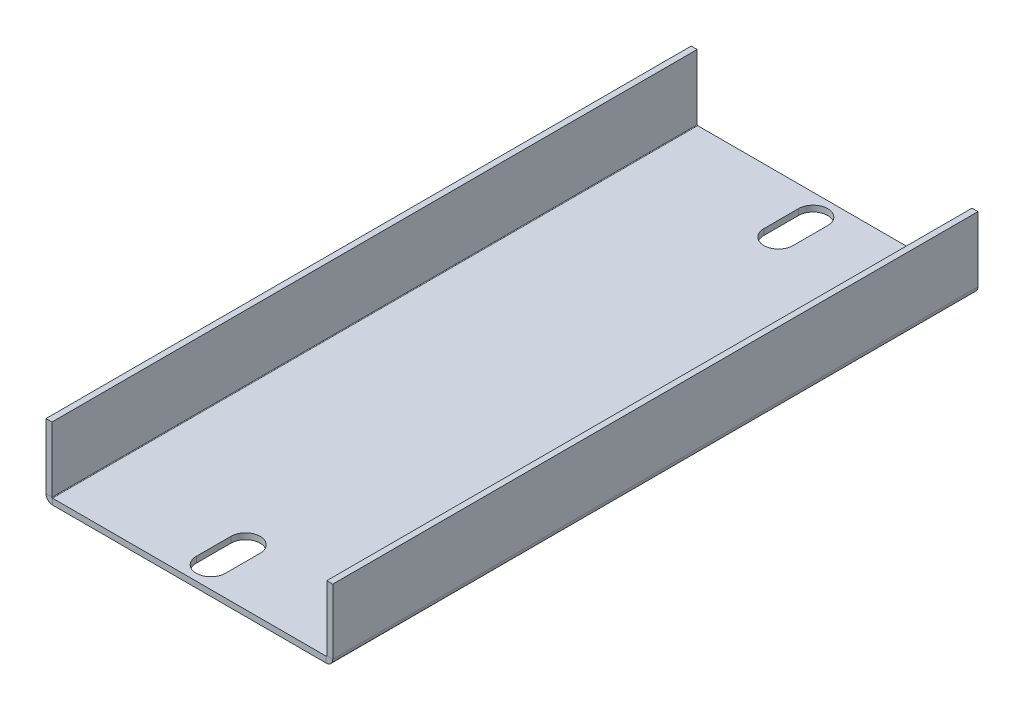
ISO-10303-21;
HEADER;
FILE_DESCRIPTION(('STEP AP214'),'2;1');
FILE_NAME('part.step','',(''),(''),'','','');
FILE_SCHEMA(('AUTOMOTIVE_DESIGN { 1 0 10303 214 1 1 1 1 }'));
ENDSEC;
DATA;
#1=APPLICATION_CONTEXT('core data for automotive mechanical design processes');
#2=APPLICATION_PROTOCOL_DEFINITION('international standard','automotive_design',2000,#1);
#3=PRODUCT_CONTEXT('',#1,'mechanical');
#4=PRODUCT('Part','Part','',(#3));
#5=PRODUCT_RELATED_PRODUCT_CATEGORY('part','',(#4));
#6=PRODUCT_DEFINITION_FORMATION('','',#4);
#7=PRODUCT_DEFINITION_CONTEXT('part definition',#1,'design');
#8=PRODUCT_DEFINITION('design','',#6,#7);
#9=PRODUCT_DEFINITION_SHAPE('','',#8);
#10=(LENGTH_UNIT() NAMED_UNIT(*) SI_UNIT(.MILLI.,.METRE.));
#11=(NAMED_UNIT(*) PLANE_ANGLE_UNIT() SI_UNIT($,.RADIAN.));
#12=(NAMED_UNIT(*) SI_UNIT($,.STERADIAN.) SOLID_ANGLE_UNIT());
#13=UNCERTAINTY_MEASURE_WITH_UNIT(LENGTH_MEASURE(1.E-05),#10,'distance_accuracy_value','');
#14=(GEOMETRIC_REPRESENTATION_CONTEXT(3) GLOBAL_UNCERTAINTY_ASSIGNED_CONTEXT((#13)) GLOBAL_UNIT_ASSIGNED_CONTEXT((#10,
#11,#12)) REPRESENTATION_CONTEXT('',''));
#15=CARTESIAN_POINT('',(0.,0.,0.));
#16=DIRECTION('',(0.,0.,1.));
#17=DIRECTION('',(1.,0.,0.));
#18=AXIS2_PLACEMENT_3D('',#15,#16,#17);
#19=CARTESIAN_POINT('',(-170.597305372499,-0.999999999999994,-11.0415945787923));
#20=DIRECTION('',(0.,1.,0.));
#21=DIRECTION('',(-1.,0.,0.));
#22=AXIS2_PLACEMENT_3D('',#19,#20,#21);
#23=PLANE('',#22);
#24=DIRECTION('',(0.,0.,1.));
#25=VECTOR('',#24,1.);
#26=CARTESIAN_POINT('',(46.5,-0.999999999999994,-11.0415945787923));
#27=LINE('',#26,#25);
#28=CARTESIAN_POINT('',(46.5,-0.999999999999994,1.00000000000001));
#29=VERTEX_POINT('',#28);
#30=CARTESIAN_POINT('',(46.5,-0.999999999999994,109.));
#31=VERTEX_POINT('',#30);
#32=EDGE_CURVE('E296',#29,#31,#27,.T.);
#33=ORIENTED_EDGE('',*,*,#32,.F.);
#34=DIRECTION('',(1.,0.,0.));
#35=VECTOR('',#34,1.);
#36=CARTESIAN_POINT('',(-170.597305372499,-0.999999999999994,1.00000000000001));
#37=LINE('',#36,#35);
#38=CARTESIAN_POINT('',(45.5,-0.999999999999994,1.00000000000001));
#39=VERTEX_POINT('',#38);
#40=EDGE_CURVE('E12',#39,#29,#37,.T.);
#41=ORIENTED_EDGE('',*,*,#40,.F.);
#42=DIRECTION('',(0.,0.,1.));
#43=VECTOR('',#42,1.);
#44=CARTESIAN_POINT('',(45.5,-0.999999999999994,-11.0415945787923));
#45=LINE('',#44,#43);
#46=CARTESIAN_POINT('',(45.5,-0.999999999999994,109.));
#47=VERTEX_POINT('',#46);
#48=EDGE_CURVE('E79',#39,#47,#45,.T.);
#49=ORIENTED_EDGE('',*,*,#48,.T.);
#50=DIRECTION('',(1.,0.,0.));
#51=VECTOR('',#50,1.);
#52=CARTESIAN_POINT('',(-170.597305372499,-0.999999999999994,109.));
#53=LINE('',#52,#51);
#54=EDGE_CURVE('E298',#47,#31,#53,.T.);
#55=ORIENTED_EDGE('',*,*,#54,.T.);
#56=EDGE_LOOP('',(#33,#41,#49,#55));
#57=FACE_BOUND('',#56,.T.);
#58=ADVANCED_FACE('F53',(#57),#23,.T.);
#59=CARTESIAN_POINT('',(-170.597305372499,-13.,109.));
#60=DIRECTION('',(0.,0.,1.));
#61=DIRECTION('',(0.,1.,0.));
#62=AXIS2_PLACEMENT_3D('',#59,#60,#61);
#63=PLANE('',#62);
#64=DIRECTION('',(0.,1.,0.));
#65=VECTOR('',#64,1.);
#66=CARTESIAN_POINT('',(46.5,-13.,109.));
#67=LINE('',#66,#65);
#68=CARTESIAN_POINT('',(46.5,-11.9,109.));
#69=VERTEX_POINT('',#68);
#70=EDGE_CURVE('E107',#69,#31,#67,.T.);
#71=ORIENTED_EDGE('',*,*,#70,.T.);
#72=ORIENTED_EDGE('',*,*,#54,.F.);
#73=DIRECTION('',(0.,-1.,0.));
#74=VECTOR('',#73,1.);
#75=CARTESIAN_POINT('',(45.5,-13.,109.));
#76=LINE('',#75,#74);
#77=CARTESIAN_POINT('',(45.5,-11.9,109.));
#78=VERTEX_POINT('',#77);
#79=EDGE_CURVE('E289',#47,#78,#76,.T.);
#80=ORIENTED_EDGE('',*,*,#79,.T.);
#81=DIRECTION('',(1.,0.,0.));
#82=VECTOR('',#81,1.);
#83=CARTESIAN_POINT('',(-170.597305372499,-11.9,109.));
#84=LINE('',#83,#82);
#85=EDGE_CURVE('E278',#78,#69,#84,.T.);
#86=ORIENTED_EDGE('',*,*,#85,.T.);
#87=EDGE_LOOP('',(#71,#72,#80,#86));
#88=FACE_BOUND('',#87,.T.);
#89=ADVANCED_FACE('F288',(#88),#63,.T.);
#90=CARTESIAN_POINT('',(46.5,-13.,109.));
#91=DIRECTION('',(-1.,0.,0.));
#92=DIRECTION('',(0.,0.,1.));
#93=AXIS2_PLACEMENT_3D('',#90,#91,#92);
#94=PLANE('',#93);
#95=ORIENTED_EDGE('',*,*,#70,.F.);
#96=DIRECTION('',(0.,0.,-1.));
#97=VECTOR('',#96,1.);
#98=CARTESIAN_POINT('',(46.5,-11.9,109.));
#99=LINE('',#98,#97);
#100=CARTESIAN_POINT('',(46.5,-11.9,1.00000000000001));
#101=VERTEX_POINT('',#100);
#102=EDGE_CURVE('E268',#69,#101,#99,.T.);
#103=ORIENTED_EDGE('',*,*,#102,.T.);
#104=DIRECTION('',(0.,1.,0.));
#105=VECTOR('',#104,1.);
#106=CARTESIAN_POINT('',(46.5,-13.,1.00000000000001));
#107=LINE('',#106,#105);
#108=EDGE_CURVE('E277',#101,#29,#107,.T.);
#109=ORIENTED_EDGE('',*,*,#108,.T.);
#110=ORIENTED_EDGE('',*,*,#32,.T.);
#111=EDGE_LOOP('',(#95,#103,#109,#110));
#112=FACE_BOUND('',#111,.T.);
#113=ADVANCED_FACE('F294',(#112),#94,.F.);
#114=CARTESIAN_POINT('',(-170.597305372499,-13.,1.00000000000001));
#115=DIRECTION('',(0.,0.,-1.));
#116=DIRECTION('',(0.,-1.,0.));
#117=AXIS2_PLACEMENT_3D('',#114,#115,#116);
#118=PLANE('',#117);
#119=ORIENTED_EDGE('',*,*,#108,.F.);
#120=DIRECTION('',(1.,0.,0.));
#121=VECTOR('',#120,1.);
#122=CARTESIAN_POINT('',(-170.597305372499,-11.9,1.00000000000001));
#123=LINE('',#122,#121);
#124=CARTESIAN_POINT('',(45.5,-11.9,1.));
#125=VERTEX_POINT('',#124);
#126=EDGE_CURVE('E407',#125,#101,#123,.T.);
#127=ORIENTED_EDGE('',*,*,#126,.F.);
#128=DIRECTION('',(0.,1.,0.));
#129=VECTOR('',#128,1.);
#130=CARTESIAN_POINT('',(45.5,-13.,1.00000000000001));
#131=LINE('',#130,#129);
#132=EDGE_CURVE('E66',#125,#39,#131,.T.);
#133=ORIENTED_EDGE('',*,*,#132,.T.);
#134=ORIENTED_EDGE('',*,*,#40,.T.);
#135=EDGE_LOOP('',(#119,#127,#133,#134));
#136=FACE_BOUND('',#135,.T.);
#137=ADVANCED_FACE('F414',(#136),#118,.T.);
#138=CARTESIAN_POINT('',(45.5,-13.,-11.0415945787923));
#139=DIRECTION('',(-1.,0.,0.));
#140=DIRECTION('',(0.,0.,1.));
#141=AXIS2_PLACEMENT_3D('',#138,#139,#140);
#142=PLANE('',#141);
#143=DIRECTION('',(0.,0.,-1.));
#144=VECTOR('',#143,1.);
#145=CARTESIAN_POINT('',(45.5,-11.9,109.));
#146=LINE('',#145,#144);
#147=EDGE_CURVE('E58',#78,#125,#146,.T.);
#148=ORIENTED_EDGE('',*,*,#147,.F.);
#149=ORIENTED_EDGE('',*,*,#79,.F.);
#150=ORIENTED_EDGE('',*,*,#48,.F.);
#151=ORIENTED_EDGE('',*,*,#132,.F.);
#152=EDGE_LOOP('',(#148,#149,#150,#151));
#153=FACE_BOUND('',#152,.T.);
#154=ADVANCED_FACE('F56',(#153),#142,.T.);
#155=CARTESIAN_POINT('',(215.597305372499,-1.,-11.0415945787923));
#156=DIRECTION('',(0.,-1.,0.));
#157=DIRECTION('',(1.,0.,0.));
#158=AXIS2_PLACEMENT_3D('',#155,#156,#157);
#159=PLANE('',#158);
#160=DIRECTION('',(-1.,0.,0.));
#161=VECTOR('',#160,1.);
#162=CARTESIAN_POINT('',(215.597305372499,-1.,1.00000000000002));
#163=LINE('',#162,#161);
#164=CARTESIAN_POINT('',(-0.500000000000014,-1.,1.00000000000001));
#165=VERTEX_POINT('',#164);
#166=CARTESIAN_POINT('',(-1.50000000000003,-0.999999999999999,1.00000000000001));
#167=VERTEX_POINT('',#166);
#168=EDGE_CURVE('E623',#165,#167,#163,.T.);
#169=ORIENTED_EDGE('',*,*,#168,.T.);
#170=DIRECTION('',(0.,0.,1.));
#171=VECTOR('',#170,1.);
#172=CARTESIAN_POINT('',(-1.50000000000001,-1.,-11.0415945787923));
#173=LINE('',#172,#171);
#174=CARTESIAN_POINT('',(-1.50000000000001,-1.,109.));
#175=VERTEX_POINT('',#174);
#176=EDGE_CURVE('E379',#167,#175,#173,.T.);
#177=ORIENTED_EDGE('',*,*,#176,.T.);
#178=DIRECTION('',(-1.,0.,0.));
#179=VECTOR('',#178,1.);
#180=CARTESIAN_POINT('',(215.597305372499,-1.,109.));
#181=LINE('',#180,#179);
#182=CARTESIAN_POINT('',(-0.500000000000025,-0.999999999999999,109.));
#183=VERTEX_POINT('',#182);
#184=EDGE_CURVE('E420',#183,#175,#181,.T.);
#185=ORIENTED_EDGE('',*,*,#184,.F.);
#186=DIRECTION('',(0.,0.,1.));
#187=VECTOR('',#186,1.);
#188=CARTESIAN_POINT('',(-0.500000000000014,-1.,-11.0415945787923));
#189=LINE('',#188,#187);
#190=EDGE_CURVE('E120',#165,#183,#189,.T.);
#191=ORIENTED_EDGE('',*,*,#190,.F.);
#192=EDGE_LOOP('',(#169,#177,#185,#191));
#193=FACE_BOUND('',#192,.T.);
#194=ADVANCED_FACE('F663',(#193),#159,.F.);
#195=CARTESIAN_POINT('',(215.597305372499,-13.,1.00000000000002));
#196=DIRECTION('',(0.,0.,-1.));
#197=DIRECTION('',(0.,1.,0.));
#198=AXIS2_PLACEMENT_3D('',#195,#196,#197);
#199=PLANE('',#198);
#200=DIRECTION('',(0.,1.,0.));
#201=VECTOR('',#200,1.);
#202=CARTESIAN_POINT('',(-1.50000000000002,-13.,1.00000000000001));
#203=LINE('',#202,#201);
#204=CARTESIAN_POINT('',(-1.50000000000001,-11.9000000000001,1.));
#205=VERTEX_POINT('',#204);
#206=EDGE_CURVE('E148',#205,#167,#203,.T.);
#207=ORIENTED_EDGE('',*,*,#206,.T.);
#208=ORIENTED_EDGE('',*,*,#168,.F.);
#209=DIRECTION('',(0.,-1.,0.));
#210=VECTOR('',#209,1.);
#211=CARTESIAN_POINT('',(-0.500000000000014,-13.,1.00000000000001));
#212=LINE('',#211,#210);
#213=CARTESIAN_POINT('',(-0.500000000000014,-11.9,1.));
#214=VERTEX_POINT('',#213);
#215=EDGE_CURVE('E369',#165,#214,#212,.T.);
#216=ORIENTED_EDGE('',*,*,#215,.T.);
#217=DIRECTION('',(-1.,0.,0.));
#218=VECTOR('',#217,1.);
#219=CARTESIAN_POINT('',(215.597305372499,-11.9,1.00000000000002));
#220=LINE('',#219,#218);
#221=EDGE_CURVE('E375',#214,#205,#220,.T.);
#222=ORIENTED_EDGE('',*,*,#221,.T.);
#223=EDGE_LOOP('',(#207,#208,#216,#222));
#224=FACE_BOUND('',#223,.T.);
#225=ADVANCED_FACE('F655',(#224),#199,.T.);
#226=CARTESIAN_POINT('',(-1.50000000000002,-13.,109.));
#227=DIRECTION('',(1.,0.,0.));
#228=DIRECTION('',(0.,0.,-1.));
#229=AXIS2_PLACEMENT_3D('',#226,#227,#228);
#230=PLANE('',#229);
#231=ORIENTED_EDGE('',*,*,#206,.F.);
#232=DIRECTION('',(0.,0.,1.));
#233=VECTOR('',#232,1.);
#234=CARTESIAN_POINT('',(-1.50000000000003,-11.9,1.00000000000001));
#235=LINE('',#234,#233);
#236=CARTESIAN_POINT('',(-1.50000000000002,-11.9,109.));
#237=VERTEX_POINT('',#236);
#238=EDGE_CURVE('E390',#205,#237,#235,.T.);
#239=ORIENTED_EDGE('',*,*,#238,.T.);
#240=DIRECTION('',(0.,1.,0.));
#241=VECTOR('',#240,1.);
#242=CARTESIAN_POINT('',(-1.50000000000003,-13.,109.));
#243=LINE('',#242,#241);
#244=EDGE_CURVE('E384',#237,#175,#243,.T.);
#245=ORIENTED_EDGE('',*,*,#244,.T.);
#246=ORIENTED_EDGE('',*,*,#176,.F.);
#247=EDGE_LOOP('',(#231,#239,#245,#246));
#248=FACE_BOUND('',#247,.T.);
#249=ADVANCED_FACE('F659',(#248),#230,.F.);
#250=CARTESIAN_POINT('',(215.597305372499,-13.,109.));
#251=DIRECTION('',(0.,0.,1.));
#252=DIRECTION('',(0.,-1.,0.));
#253=AXIS2_PLACEMENT_3D('',#250,#251,#252);
#254=PLANE('',#253);
#255=ORIENTED_EDGE('',*,*,#244,.F.);
#256=DIRECTION('',(-1.,0.,0.));
#257=VECTOR('',#256,1.);
#258=CARTESIAN_POINT('',(215.597305372499,-11.9,109.));
#259=LINE('',#258,#257);
#260=CARTESIAN_POINT('',(-0.500000000000015,-11.9,109.));
#261=VERTEX_POINT('',#260);
#262=EDGE_CURVE('E356',#261,#237,#259,.T.);
#263=ORIENTED_EDGE('',*,*,#262,.F.);
#264=DIRECTION('',(0.,1.,0.));
#265=VECTOR('',#264,1.);
#266=CARTESIAN_POINT('',(-0.500000000000025,-13.,109.));
#267=LINE('',#266,#265);
#268=EDGE_CURVE('E389',#261,#183,#267,.T.);
#269=ORIENTED_EDGE('',*,*,#268,.T.);
#270=ORIENTED_EDGE('',*,*,#184,.T.);
#271=EDGE_LOOP('',(#255,#263,#269,#270));
#272=FACE_BOUND('',#271,.T.);
#273=ADVANCED_FACE('F665',(#272),#254,.T.);
#274=CARTESIAN_POINT('',(-0.500000000000014,-13.,-11.0415945787923));
#275=DIRECTION('',(1.,0.,0.));
#276=DIRECTION('',(0.,0.,-1.));
#277=AXIS2_PLACEMENT_3D('',#274,#275,#276);
#278=PLANE('',#277);
#279=DIRECTION('',(0.,0.,1.));
#280=VECTOR('',#279,1.);
#281=CARTESIAN_POINT('',(-0.500000000000025,-11.9,1.00000000000001));
#282=LINE('',#281,#280);
#283=EDGE_CURVE('E352',#214,#261,#282,.T.);
#284=ORIENTED_EDGE('',*,*,#283,.F.);
#285=ORIENTED_EDGE('',*,*,#215,.F.);
#286=ORIENTED_EDGE('',*,*,#190,.T.);
#287=ORIENTED_EDGE('',*,*,#268,.F.);
#288=EDGE_LOOP('',(#284,#285,#286,#287));
#289=FACE_BOUND('',#288,.T.);
#290=ADVANCED_FACE('F667',(#289),#278,.T.);
#291=CARTESIAN_POINT('',(0.,-13.,0.));
#292=DIRECTION('',(0.,1.,0.));
#293=DIRECTION('',(0.,0.,1.));
#294=AXIS2_PLACEMENT_3D('',#291,#292,#293);
#295=PLANE('',#294);
#296=CARTESIAN_POINT('',(22.5,-13.,4.6));
#297=DIRECTION('',(0.,-1.,0.));
#298=DIRECTION('',(0.,0.,-1.));
#299=AXIS2_PLACEMENT_3D('',#296,#297,#298);
#300=CIRCLE('',#299,2.45);
#301=CARTESIAN_POINT('',(20.05,-13.,4.6));
#302=VERTEX_POINT('',#301);
#303=CARTESIAN_POINT('',(24.95,-13.,4.60000000000001));
#304=VERTEX_POINT('',#303);
#305=EDGE_CURVE('E505',#302,#304,#300,.T.);
#306=ORIENTED_EDGE('',*,*,#305,.F.);
#307=DIRECTION('',(0.,0.,-1.));
#308=VECTOR('',#307,1.);
#309=CARTESIAN_POINT('',(20.05,-13.,4.6));
#310=LINE('',#309,#308);
#311=CARTESIAN_POINT('',(20.05,-13.,10.4));
#312=VERTEX_POINT('',#311);
#313=EDGE_CURVE('E512',#312,#302,#310,.T.);
#314=ORIENTED_EDGE('',*,*,#313,.F.);
#315=CARTESIAN_POINT('',(22.5,-13.,10.4));
#316=DIRECTION('',(0.,-1.,0.));
#317=DIRECTION('',(0.,0.,-1.));
#318=AXIS2_PLACEMENT_3D('',#315,#316,#317);
#319=CIRCLE('',#318,2.45);
#320=CARTESIAN_POINT('',(24.95,-13.,10.4));
#321=VERTEX_POINT('',#320);
#322=EDGE_CURVE('E526',#321,#312,#319,.T.);
#323=ORIENTED_EDGE('',*,*,#322,.F.);
#324=DIRECTION('',(0.,0.,1.));
#325=VECTOR('',#324,1.);
#326=CARTESIAN_POINT('',(24.95,-13.,4.60000000000001));
#327=LINE('',#326,#325);
#328=EDGE_CURVE('E500',#304,#321,#327,.T.);
#329=ORIENTED_EDGE('',*,*,#328,.F.);
#330=EDGE_LOOP('',(#306,#314,#323,#329));
#331=FACE_BOUND('',#330,.T.);
#332=CARTESIAN_POINT('',(22.5,-13.,105.4));
#333=DIRECTION('',(0.,-1.,0.));
#334=DIRECTION('',(0.,0.,1.));
#335=AXIS2_PLACEMENT_3D('',#332,#333,#334);
#336=CIRCLE('',#335,2.45);
#337=CARTESIAN_POINT('',(24.95,-13.,105.4));
#338=VERTEX_POINT('',#337);
#339=CARTESIAN_POINT('',(20.05,-13.,105.4));
#340=VERTEX_POINT('',#339);
#341=EDGE_CURVE('E486',#338,#340,#336,.T.);
#342=ORIENTED_EDGE('',*,*,#341,.F.);
#343=DIRECTION('',(0.,0.,1.));
#344=VECTOR('',#343,1.);
#345=CARTESIAN_POINT('',(24.95,-13.,105.4));
#346=LINE('',#345,#344);
#347=CARTESIAN_POINT('',(24.95,-13.,99.6));
#348=VERTEX_POINT('',#347);
#349=EDGE_CURVE('E492',#348,#338,#346,.T.);
#350=ORIENTED_EDGE('',*,*,#349,.F.);
#351=CARTESIAN_POINT('',(22.5,-13.,99.6));
#352=DIRECTION('',(0.,-1.,0.));
#353=DIRECTION('',(0.,0.,1.));
#354=AXIS2_PLACEMENT_3D('',#351,#352,#353);
#355=CIRCLE('',#354,2.45);
#356=CARTESIAN_POINT('',(20.05,-13.,99.6));
#357=VERTEX_POINT('',#356);
#358=EDGE_CURVE('E470',#357,#348,#355,.T.);
#359=ORIENTED_EDGE('',*,*,#358,.F.);
#360=DIRECTION('',(0.,0.,-1.));
#361=VECTOR('',#360,1.);
#362=CARTESIAN_POINT('',(20.05,-13.,105.4));
#363=LINE('',#362,#361);
#364=EDGE_CURVE('E465',#340,#357,#363,.T.);
#365=ORIENTED_EDGE('',*,*,#364,.F.);
#366=EDGE_LOOP('',(#342,#350,#359,#365));
#367=FACE_BOUND('',#366,.T.);
#368=DIRECTION('',(0.,0.,-1.));
#369=VECTOR('',#368,1.);
#370=CARTESIAN_POINT('',(45.4,-13.,109.));
#371=LINE('',#370,#369);
#372=CARTESIAN_POINT('',(45.4,-13.,109.));
#373=VERTEX_POINT('',#372);
#374=CARTESIAN_POINT('',(45.4,-13.,1.));
#375=VERTEX_POINT('',#374);
#376=EDGE_CURVE('E441',#373,#375,#371,.T.);
#377=ORIENTED_EDGE('',*,*,#376,.F.);
#378=DIRECTION('',(-1.,0.,0.));
#379=VECTOR('',#378,1.);
#380=CARTESIAN_POINT('',(46.5,-13.,109.));
#381=LINE('',#380,#379);
#382=CARTESIAN_POINT('',(-0.400000000000003,-13.,109.));
#383=VERTEX_POINT('',#382);
#384=EDGE_CURVE('E481',#373,#383,#381,.T.);
#385=ORIENTED_EDGE('',*,*,#384,.T.);
#386=DIRECTION('',(0.,0.,1.));
#387=VECTOR('',#386,1.);
#388=CARTESIAN_POINT('',(-0.400000000000014,-13.,1.00000000000001));
#389=LINE('',#388,#387);
#390=CARTESIAN_POINT('',(-0.400000000000005,-13.,1.));
#391=VERTEX_POINT('',#390);
#392=EDGE_CURVE('E357',#391,#383,#389,.T.);
#393=ORIENTED_EDGE('',*,*,#392,.F.);
#394=DIRECTION('',(1.,0.,0.));
#395=VECTOR('',#394,1.);
#396=CARTESIAN_POINT('',(46.5,-13.,1.00000000000001));
#397=LINE('',#396,#395);
#398=EDGE_CURVE('E487',#391,#375,#397,.T.);
#399=ORIENTED_EDGE('',*,*,#398,.T.);
#400=EDGE_LOOP('',(#377,#385,#393,#399));
#401=FACE_BOUND('',#400,.T.);
#402=ADVANCED_FACE('F547',(#331,#367,#401),#295,.F.);
#403=CARTESIAN_POINT('',(0.,-12.,0.));
#404=DIRECTION('',(0.,1.,0.));
#405=DIRECTION('',(0.,0.,1.));
#406=AXIS2_PLACEMENT_3D('',#403,#404,#405);
#407=PLANE('',#406);
#408=DIRECTION('',(0.,0.,-1.));
#409=VECTOR('',#408,1.);
#410=CARTESIAN_POINT('',(20.05,-12.,4.6));
#411=LINE('',#410,#409);
#412=CARTESIAN_POINT('',(20.05,-12.,10.4));
#413=VERTEX_POINT('',#412);
#414=CARTESIAN_POINT('',(20.05,-12.,4.6));
#415=VERTEX_POINT('',#414);
#416=EDGE_CURVE('E552',#413,#415,#411,.T.);
#417=ORIENTED_EDGE('',*,*,#416,.T.);
#418=CARTESIAN_POINT('',(22.5,-12.,4.6));
#419=DIRECTION('',(0.,-1.,0.));
#420=DIRECTION('',(0.,0.,-1.));
#421=AXIS2_PLACEMENT_3D('',#418,#419,#420);
#422=CIRCLE('',#421,2.45);
#423=CARTESIAN_POINT('',(24.95,-12.,4.60000000000001));
#424=VERTEX_POINT('',#423);
#425=EDGE_CURVE('E539',#415,#424,#422,.T.);
#426=ORIENTED_EDGE('',*,*,#425,.T.);
#427=DIRECTION('',(0.,0.,1.));
#428=VECTOR('',#427,1.);
#429=CARTESIAN_POINT('',(24.95,-12.,4.60000000000001));
#430=LINE('',#429,#428);
#431=CARTESIAN_POINT('',(24.95,-12.,10.4));
#432=VERTEX_POINT('',#431);
#433=EDGE_CURVE('E545',#424,#432,#430,.T.);
#434=ORIENTED_EDGE('',*,*,#433,.T.);
#435=CARTESIAN_POINT('',(22.5,-12.,10.4));
#436=DIRECTION('',(0.,-1.,0.));
#437=DIRECTION('',(0.,0.,-1.));
#438=AXIS2_PLACEMENT_3D('',#435,#436,#437);
#439=CIRCLE('',#438,2.45);
#440=EDGE_CURVE('E590',#432,#413,#439,.T.);
#441=ORIENTED_EDGE('',*,*,#440,.T.);
#442=EDGE_LOOP('',(#417,#426,#434,#441));
#443=FACE_BOUND('',#442,.T.);
#444=DIRECTION('',(0.,0.,1.));
#445=VECTOR('',#444,1.);
#446=CARTESIAN_POINT('',(24.95,-12.,105.4));
#447=LINE('',#446,#445);
#448=CARTESIAN_POINT('',(24.95,-12.,99.6));
#449=VERTEX_POINT('',#448);
#450=CARTESIAN_POINT('',(24.95,-12.,105.4));
#451=VERTEX_POINT('',#450);
#452=EDGE_CURVE('E594',#449,#451,#447,.T.);
#453=ORIENTED_EDGE('',*,*,#452,.T.);
#454=CARTESIAN_POINT('',(22.5,-12.,105.4));
#455=DIRECTION('',(0.,-1.,0.));
#456=DIRECTION('',(0.,0.,1.));
#457=AXIS2_PLACEMENT_3D('',#454,#455,#456);
#458=CIRCLE('',#457,2.45);
#459=CARTESIAN_POINT('',(20.05,-12.,105.4));
#460=VERTEX_POINT('',#459);
#461=EDGE_CURVE('E563',#451,#460,#458,.T.);
#462=ORIENTED_EDGE('',*,*,#461,.T.);
#463=DIRECTION('',(0.,0.,-1.));
#464=VECTOR('',#463,1.);
#465=CARTESIAN_POINT('',(20.05,-12.,105.4));
#466=LINE('',#465,#464);
#467=CARTESIAN_POINT('',(20.05,-12.,99.6));
#468=VERTEX_POINT('',#467);
#469=EDGE_CURVE('E559',#460,#468,#466,.T.);
#470=ORIENTED_EDGE('',*,*,#469,.T.);
#471=CARTESIAN_POINT('',(22.5,-12.,99.6));
#472=DIRECTION('',(0.,-1.,0.));
#473=DIRECTION('',(0.,0.,1.));
#474=AXIS2_PLACEMENT_3D('',#471,#472,#473);
#475=CIRCLE('',#474,2.45);
#476=EDGE_CURVE('E556',#468,#449,#475,.T.);
#477=ORIENTED_EDGE('',*,*,#476,.T.);
#478=EDGE_LOOP('',(#453,#462,#470,#477));
#479=FACE_BOUND('',#478,.T.);
#480=DIRECTION('',(-1.,0.,0.));
#481=VECTOR('',#480,1.);
#482=CARTESIAN_POINT('',(46.5,-12.,109.));
#483=LINE('',#482,#481);
#484=CARTESIAN_POINT('',(45.4,-12.,109.));
#485=VERTEX_POINT('',#484);
#486=CARTESIAN_POINT('',(-0.400000000000011,-12.,109.));
#487=VERTEX_POINT('',#486);
#488=EDGE_CURVE('E572',#485,#487,#483,.T.);
#489=ORIENTED_EDGE('',*,*,#488,.F.);
#490=DIRECTION('',(0.,0.,-1.));
#491=VECTOR('',#490,1.);
#492=CARTESIAN_POINT('',(45.4,-12.,109.));
#493=LINE('',#492,#491);
#494=CARTESIAN_POINT('',(45.4,-12.,1.00000000000001));
#495=VERTEX_POINT('',#494);
#496=EDGE_CURVE('E444',#485,#495,#493,.T.);
#497=ORIENTED_EDGE('',*,*,#496,.T.);
#498=DIRECTION('',(1.,0.,0.));
#499=VECTOR('',#498,1.);
#500=CARTESIAN_POINT('',(46.5,-12.,1.00000000000001));
#501=LINE('',#500,#499);
#502=CARTESIAN_POINT('',(-0.400000000000014,-12.,1.));
#503=VERTEX_POINT('',#502);
#504=EDGE_CURVE('E342',#503,#495,#501,.T.);
#505=ORIENTED_EDGE('',*,*,#504,.F.);
#506=DIRECTION('',(0.,0.,1.));
#507=VECTOR('',#506,1.);
#508=CARTESIAN_POINT('',(-0.400000000000014,-12.,1.00000000000001));
#509=LINE('',#508,#507);
#510=EDGE_CURVE('E426',#503,#487,#509,.T.);
#511=ORIENTED_EDGE('',*,*,#510,.T.);
#512=EDGE_LOOP('',(#489,#497,#505,#511));
#513=FACE_BOUND('',#512,.T.);
#514=ADVANCED_FACE('F601',(#443,#479,#513),#407,.T.);
#515=CARTESIAN_POINT('',(20.05,-13.,105.4));
#516=DIRECTION('',(1.,0.,0.));
#517=DIRECTION('',(0.,0.,-1.));
#518=AXIS2_PLACEMENT_3D('',#515,#516,#517);
#519=PLANE('',#518);
#520=ORIENTED_EDGE('',*,*,#469,.F.);
#521=DIRECTION('',(0.,1.,0.));
#522=VECTOR('',#521,1.);
#523=CARTESIAN_POINT('',(20.05,-13.,105.4));
#524=LINE('',#523,#522);
#525=EDGE_CURVE('E457',#340,#460,#524,.T.);
#526=ORIENTED_EDGE('',*,*,#525,.F.);
#527=ORIENTED_EDGE('',*,*,#364,.T.);
#528=DIRECTION('',(0.,1.,0.));
#529=VECTOR('',#528,1.);
#530=CARTESIAN_POINT('',(20.05,-13.,99.6));
#531=LINE('',#530,#529);
#532=EDGE_CURVE('E449',#357,#468,#531,.T.);
#533=ORIENTED_EDGE('',*,*,#532,.T.);
#534=EDGE_LOOP('',(#520,#526,#527,#533));
#535=FACE_BOUND('',#534,.T.);
#536=ADVANCED_FACE('F607',(#535),#519,.T.);
#537=CARTESIAN_POINT('',(22.5,-13.,99.6));
#538=DIRECTION('',(0.,1.,0.));
#539=DIRECTION('',(0.,0.,1.));
#540=AXIS2_PLACEMENT_3D('',#537,#538,#539);
#541=CYLINDRICAL_SURFACE('',#540,2.45);
#542=ORIENTED_EDGE('',*,*,#476,.F.);
#543=ORIENTED_EDGE('',*,*,#532,.F.);
#544=ORIENTED_EDGE('',*,*,#358,.T.);
#545=DIRECTION('',(0.,1.,0.));
#546=VECTOR('',#545,1.);
#547=CARTESIAN_POINT('',(24.95,-13.,99.6));
#548=LINE('',#547,#546);
#549=EDGE_CURVE('E453',#348,#449,#548,.T.);
#550=ORIENTED_EDGE('',*,*,#549,.T.);
#551=EDGE_LOOP('',(#542,#543,#544,#550));
#552=FACE_BOUND('',#551,.T.);
#553=ADVANCED_FACE('F615',(#552),#541,.F.);
#554=CARTESIAN_POINT('',(24.95,-13.,105.4));
#555=DIRECTION('',(-1.,0.,0.));
#556=DIRECTION('',(0.,0.,1.));
#557=AXIS2_PLACEMENT_3D('',#554,#555,#556);
#558=PLANE('',#557);
#559=ORIENTED_EDGE('',*,*,#452,.F.);
#560=ORIENTED_EDGE('',*,*,#549,.F.);
#561=ORIENTED_EDGE('',*,*,#349,.T.);
#562=DIRECTION('',(0.,1.,0.));
#563=VECTOR('',#562,1.);
#564=CARTESIAN_POINT('',(24.95,-13.,105.4));
#565=LINE('',#564,#563);
#566=EDGE_CURVE('E461',#338,#451,#565,.T.);
#567=ORIENTED_EDGE('',*,*,#566,.T.);
#568=EDGE_LOOP('',(#559,#560,#561,#567));
#569=FACE_BOUND('',#568,.T.);
#570=ADVANCED_FACE('F618',(#569),#558,.T.);
#571=CARTESIAN_POINT('',(22.5,-13.,105.4));
#572=DIRECTION('',(0.,1.,0.));
#573=DIRECTION('',(0.,0.,1.));
#574=AXIS2_PLACEMENT_3D('',#571,#572,#573);
#575=CYLINDRICAL_SURFACE('',#574,2.45);
#576=ORIENTED_EDGE('',*,*,#461,.F.);
#577=ORIENTED_EDGE('',*,*,#566,.F.);
#578=ORIENTED_EDGE('',*,*,#341,.T.);
#579=ORIENTED_EDGE('',*,*,#525,.T.);
#580=EDGE_LOOP('',(#576,#577,#578,#579));
#581=FACE_BOUND('',#580,.T.);
#582=ADVANCED_FACE('F609',(#581),#575,.F.);
#583=CARTESIAN_POINT('',(22.5,-13.,4.6));
#584=DIRECTION('',(0.,1.,0.));
#585=DIRECTION('',(0.,0.,1.));
#586=AXIS2_PLACEMENT_3D('',#583,#584,#585);
#587=CYLINDRICAL_SURFACE('',#586,2.45);
#588=ORIENTED_EDGE('',*,*,#425,.F.);
#589=DIRECTION('',(0.,1.,0.));
#590=VECTOR('',#589,1.);
#591=CARTESIAN_POINT('',(20.05,-13.,4.6));
#592=LINE('',#591,#590);
#593=EDGE_CURVE('E517',#302,#415,#592,.T.);
#594=ORIENTED_EDGE('',*,*,#593,.F.);
#595=ORIENTED_EDGE('',*,*,#305,.T.);
#596=DIRECTION('',(0.,1.,0.));
#597=VECTOR('',#596,1.);
#598=CARTESIAN_POINT('',(24.95,-13.,4.60000000000001));
#599=LINE('',#598,#597);
#600=EDGE_CURVE('E506',#304,#424,#599,.T.);
#601=ORIENTED_EDGE('',*,*,#600,.T.);
#602=EDGE_LOOP('',(#588,#594,#595,#601));
#603=FACE_BOUND('',#602,.T.);
#604=ADVANCED_FACE('F537',(#603),#587,.F.);
#605=CARTESIAN_POINT('',(24.95,-13.,4.60000000000001));
#606=DIRECTION('',(-1.,0.,0.));
#607=DIRECTION('',(0.,0.,1.));
#608=AXIS2_PLACEMENT_3D('',#605,#606,#607);
#609=PLANE('',#608);
#610=ORIENTED_EDGE('',*,*,#433,.F.);
#611=ORIENTED_EDGE('',*,*,#600,.F.);
#612=ORIENTED_EDGE('',*,*,#328,.T.);
#613=DIRECTION('',(0.,1.,0.));
#614=VECTOR('',#613,1.);
#615=CARTESIAN_POINT('',(24.95,-13.,10.4));
#616=LINE('',#615,#614);
#617=EDGE_CURVE('E523',#321,#432,#616,.T.);
#618=ORIENTED_EDGE('',*,*,#617,.T.);
#619=EDGE_LOOP('',(#610,#611,#612,#618));
#620=FACE_BOUND('',#619,.T.);
#621=ADVANCED_FACE('F544',(#620),#609,.T.);
#622=CARTESIAN_POINT('',(22.5,-13.,10.4));
#623=DIRECTION('',(0.,1.,0.));
#624=DIRECTION('',(0.,0.,1.));
#625=AXIS2_PLACEMENT_3D('',#622,#623,#624);
#626=CYLINDRICAL_SURFACE('',#625,2.45);
#627=ORIENTED_EDGE('',*,*,#440,.F.);
#628=ORIENTED_EDGE('',*,*,#617,.F.);
#629=ORIENTED_EDGE('',*,*,#322,.T.);
#630=DIRECTION('',(0.,1.,0.));
#631=VECTOR('',#630,1.);
#632=CARTESIAN_POINT('',(20.05,-13.,10.4));
#633=LINE('',#632,#631);
#634=EDGE_CURVE('E518',#312,#413,#633,.T.);
#635=ORIENTED_EDGE('',*,*,#634,.T.);
#636=EDGE_LOOP('',(#627,#628,#629,#635));
#637=FACE_BOUND('',#636,.T.);
#638=ADVANCED_FACE('F743',(#637),#626,.F.);
#639=CARTESIAN_POINT('',(20.05,-13.,4.6));
#640=DIRECTION('',(1.,0.,0.));
#641=DIRECTION('',(0.,0.,-1.));
#642=AXIS2_PLACEMENT_3D('',#639,#640,#641);
#643=PLANE('',#642);
#644=ORIENTED_EDGE('',*,*,#416,.F.);
#645=ORIENTED_EDGE('',*,*,#634,.F.);
#646=ORIENTED_EDGE('',*,*,#313,.T.);
#647=ORIENTED_EDGE('',*,*,#593,.T.);
#648=EDGE_LOOP('',(#644,#645,#646,#647));
#649=FACE_BOUND('',#648,.T.);
#650=ADVANCED_FACE('F551',(#649),#643,.T.);
#651=CARTESIAN_POINT('',(46.5,221.620033245245,109.));
#652=DIRECTION('',(0.,0.,1.));
#653=DIRECTION('',(1.,0.,0.));
#654=AXIS2_PLACEMENT_3D('',#651,#652,#653);
#655=PLANE('',#654);
#656=ORIENTED_EDGE('',*,*,#384,.F.);
#657=DIRECTION('',(0.,-1.,0.));
#658=VECTOR('',#657,1.);
#659=CARTESIAN_POINT('',(45.4,221.620033245245,109.));
#660=LINE('',#659,#658);
#661=EDGE_CURVE('E284',#485,#373,#660,.T.);
#662=ORIENTED_EDGE('',*,*,#661,.F.);
#663=ORIENTED_EDGE('',*,*,#488,.T.);
#664=DIRECTION('',(0.,-1.,0.));
#665=VECTOR('',#664,1.);
#666=CARTESIAN_POINT('',(-0.400000000000011,221.620033245245,109.));
#667=LINE('',#666,#665);
#668=EDGE_CURVE('E438',#487,#383,#667,.T.);
#669=ORIENTED_EDGE('',*,*,#668,.T.);
#670=EDGE_LOOP('',(#656,#662,#663,#669));
#671=FACE_BOUND('',#670,.T.);
#672=ADVANCED_FACE('F646',(#671),#655,.T.);
#673=CARTESIAN_POINT('',(46.5,221.620033245245,1.00000000000001));
#674=DIRECTION('',(0.,0.,-1.));
#675=DIRECTION('',(-1.,0.,0.));
#676=AXIS2_PLACEMENT_3D('',#673,#674,#675);
#677=PLANE('',#676);
#678=ORIENTED_EDGE('',*,*,#398,.F.);
#679=DIRECTION('',(0.,-1.,0.));
#680=VECTOR('',#679,1.);
#681=CARTESIAN_POINT('',(-0.400000000000011,221.620033245245,1.00000000000001));
#682=LINE('',#681,#680);
#683=EDGE_CURVE('E435',#503,#391,#682,.T.);
#684=ORIENTED_EDGE('',*,*,#683,.F.);
#685=ORIENTED_EDGE('',*,*,#504,.T.);
#686=DIRECTION('',(0.,-1.,0.));
#687=VECTOR('',#686,1.);
#688=CARTESIAN_POINT('',(45.4,221.620033245245,1.00000000000001));
#689=LINE('',#688,#687);
#690=EDGE_CURVE('E409',#495,#375,#689,.T.);
#691=ORIENTED_EDGE('',*,*,#690,.T.);
#692=EDGE_LOOP('',(#678,#684,#685,#691));
#693=FACE_BOUND('',#692,.T.);
#694=ADVANCED_FACE('F640',(#693),#677,.T.);
#695=CARTESIAN_POINT('',(-0.400000000000015,-11.9,109.));
#696=DIRECTION('',(0.,0.,1.));
#697=DIRECTION('',(1.,0.,0.));
#698=AXIS2_PLACEMENT_3D('',#695,#696,#697);
#699=PLANE('',#698);
#700=ORIENTED_EDGE('',*,*,#668,.F.);
#701=CARTESIAN_POINT('',(-0.400000000000015,-11.9,109.));
#702=DIRECTION('',(0.,0.,1.));
#703=DIRECTION('',(1.,0.,0.));
#704=AXIS2_PLACEMENT_3D('',#701,#702,#703);
#705=CIRCLE('',#704,0.1);
#706=EDGE_CURVE('E170',#487,#261,#705,.F.);
#707=ORIENTED_EDGE('',*,*,#706,.T.);
#708=ORIENTED_EDGE('',*,*,#262,.T.);
#709=CARTESIAN_POINT('',(-0.400000000000015,-11.9,109.));
#710=DIRECTION('',(0.,0.,1.));
#711=DIRECTION('',(1.,0.,0.));
#712=AXIS2_PLACEMENT_3D('',#709,#710,#711);
#713=CIRCLE('',#712,1.1);
#714=EDGE_CURVE('E138',#383,#237,#713,.F.);
#715=ORIENTED_EDGE('',*,*,#714,.F.);
#716=EDGE_LOOP('',(#700,#707,#708,#715));
#717=FACE_BOUND('',#716,.T.);
#718=ADVANCED_FACE('F648',(#717),#699,.T.);
#719=CARTESIAN_POINT('',(-0.400000000000014,-11.9,1.));
#720=DIRECTION('',(0.,0.,-1.));
#721=DIRECTION('',(-1.,0.,0.));
#722=AXIS2_PLACEMENT_3D('',#719,#720,#721);
#723=PLANE('',#722);
#724=ORIENTED_EDGE('',*,*,#221,.F.);
#725=CARTESIAN_POINT('',(-0.400000000000014,-11.9,1.));
#726=DIRECTION('',(0.,0.,1.));
#727=DIRECTION('',(1.,0.,0.));
#728=AXIS2_PLACEMENT_3D('',#725,#726,#727);
#729=CIRCLE('',#728,0.1);
#730=EDGE_CURVE('E343',#214,#503,#729,.T.);
#731=ORIENTED_EDGE('',*,*,#730,.T.);
#732=ORIENTED_EDGE('',*,*,#683,.T.);
#733=CARTESIAN_POINT('',(-0.400000000000014,-11.9,1.));
#734=DIRECTION('',(0.,0.,1.));
#735=DIRECTION('',(1.,0.,0.));
#736=AXIS2_PLACEMENT_3D('',#733,#734,#735);
#737=CIRCLE('',#736,1.1);
#738=EDGE_CURVE('E333',#205,#391,#737,.T.);
#739=ORIENTED_EDGE('',*,*,#738,.F.);
#740=EDGE_LOOP('',(#724,#731,#732,#739));
#741=FACE_BOUND('',#740,.T.);
#742=ADVANCED_FACE('F653',(#741),#723,.T.);
#743=CARTESIAN_POINT('',(-0.400000000000014,-11.9,-126.949052360695));
#744=DIRECTION('',(0.,0.,1.));
#745=DIRECTION('',(1.,0.,0.));
#746=AXIS2_PLACEMENT_3D('',#743,#744,#745);
#747=CYLINDRICAL_SURFACE('',#746,1.1);
#748=ORIENTED_EDGE('',*,*,#738,.T.);
#749=ORIENTED_EDGE('',*,*,#392,.T.);
#750=ORIENTED_EDGE('',*,*,#714,.T.);
#751=ORIENTED_EDGE('',*,*,#238,.F.);
#752=EDGE_LOOP('',(#748,#749,#750,#751));
#753=FACE_BOUND('',#752,.T.);
#754=ADVANCED_FACE('F650',(#753),#747,.T.);
#755=CARTESIAN_POINT('',(-0.400000000000014,-11.9,-126.949052360695));
#756=DIRECTION('',(0.,0.,1.));
#757=DIRECTION('',(1.,0.,0.));
#758=AXIS2_PLACEMENT_3D('',#755,#756,#757);
#759=CYLINDRICAL_SURFACE('',#758,0.1);
#760=ORIENTED_EDGE('',*,*,#730,.F.);
#761=ORIENTED_EDGE('',*,*,#283,.T.);
#762=ORIENTED_EDGE('',*,*,#706,.F.);
#763=ORIENTED_EDGE('',*,*,#510,.F.);
#764=EDGE_LOOP('',(#760,#761,#762,#763));
#765=FACE_BOUND('',#764,.T.);
#766=ADVANCED_FACE('F668',(#765),#759,.F.);
#767=CARTESIAN_POINT('',(45.4,-11.9,1.));
#768=DIRECTION('',(0.,0.,-1.));
#769=DIRECTION('',(-1.,0.,0.));
#770=AXIS2_PLACEMENT_3D('',#767,#768,#769);
#771=PLANE('',#770);
#772=ORIENTED_EDGE('',*,*,#690,.F.);
#773=CARTESIAN_POINT('',(45.4,-11.9,1.));
#774=DIRECTION('',(0.,0.,-1.));
#775=DIRECTION('',(-1.,0.,0.));
#776=AXIS2_PLACEMENT_3D('',#773,#774,#775);
#777=CIRCLE('',#776,0.0999999999999983);
#778=EDGE_CURVE('E159',#495,#125,#777,.F.);
#779=ORIENTED_EDGE('',*,*,#778,.T.);
#780=ORIENTED_EDGE('',*,*,#126,.T.);
#781=CARTESIAN_POINT('',(45.4,-11.9,1.));
#782=DIRECTION('',(0.,0.,-1.));
#783=DIRECTION('',(-1.,0.,0.));
#784=AXIS2_PLACEMENT_3D('',#781,#782,#783);
#785=CIRCLE('',#784,1.1);
#786=EDGE_CURVE('E99',#375,#101,#785,.F.);
#787=ORIENTED_EDGE('',*,*,#786,.F.);
#788=EDGE_LOOP('',(#772,#779,#780,#787));
#789=FACE_BOUND('',#788,.T.);
#790=ADVANCED_FACE('F405',(#789),#771,.T.);
#791=CARTESIAN_POINT('',(45.4,-11.9,109.));
#792=DIRECTION('',(0.,0.,1.));
#793=DIRECTION('',(1.,0.,0.));
#794=AXIS2_PLACEMENT_3D('',#791,#792,#793);
#795=PLANE('',#794);
#796=ORIENTED_EDGE('',*,*,#85,.F.);
#797=CARTESIAN_POINT('',(45.4,-11.9,109.));
#798=DIRECTION('',(0.,0.,-1.));
#799=DIRECTION('',(-1.,0.,0.));
#800=AXIS2_PLACEMENT_3D('',#797,#798,#799);
#801=CIRCLE('',#800,0.0999999999999983);
#802=EDGE_CURVE('E397',#78,#485,#801,.T.);
#803=ORIENTED_EDGE('',*,*,#802,.T.);
#804=ORIENTED_EDGE('',*,*,#661,.T.);
#805=CARTESIAN_POINT('',(45.4,-11.9,109.));
#806=DIRECTION('',(0.,0.,-1.));
#807=DIRECTION('',(-1.,0.,0.));
#808=AXIS2_PLACEMENT_3D('',#805,#806,#807);
#809=CIRCLE('',#808,1.1);
#810=EDGE_CURVE('E271',#69,#373,#809,.T.);
#811=ORIENTED_EDGE('',*,*,#810,.F.);
#812=EDGE_LOOP('',(#796,#803,#804,#811));
#813=FACE_BOUND('',#812,.T.);
#814=ADVANCED_FACE('F281',(#813),#795,.T.);
#815=CARTESIAN_POINT('',(45.4,-11.9,232.316219533361));
#816=DIRECTION('',(0.,0.,-1.));
#817=DIRECTION('',(-1.,0.,0.));
#818=AXIS2_PLACEMENT_3D('',#815,#816,#817);
#819=CYLINDRICAL_SURFACE('',#818,1.1);
#820=ORIENTED_EDGE('',*,*,#810,.T.);
#821=ORIENTED_EDGE('',*,*,#376,.T.);
#822=ORIENTED_EDGE('',*,*,#786,.T.);
#823=ORIENTED_EDGE('',*,*,#102,.F.);
#824=EDGE_LOOP('',(#820,#821,#822,#823));
#825=FACE_BOUND('',#824,.T.);
#826=ADVANCED_FACE('F270',(#825),#819,.T.);
#827=CARTESIAN_POINT('',(45.4,-11.9,232.316219533361));
#828=DIRECTION('',(0.,0.,-1.));
#829=DIRECTION('',(-1.,0.,0.));
#830=AXIS2_PLACEMENT_3D('',#827,#828,#829);
#831=CYLINDRICAL_SURFACE('',#830,0.0999999999999983);
#832=ORIENTED_EDGE('',*,*,#802,.F.);
#833=ORIENTED_EDGE('',*,*,#147,.T.);
#834=ORIENTED_EDGE('',*,*,#778,.F.);
#835=ORIENTED_EDGE('',*,*,#496,.F.);
#836=EDGE_LOOP('',(#832,#833,#834,#835));
#837=FACE_BOUND('',#836,.T.);
#838=ADVANCED_FACE('F644',(#837),#831,.F.);
#839=CLOSED_SHELL('',(#58,#89,#113,#137,#154,#194,#225,#249,#273,#290,#402,#514,#536,#553,#570,
#582,#604,#621,#638,#650,#672,#694,#718,#742,#754,#766,#790,#814,#826,#838));
#840=MANIFOLD_SOLID_BREP('B2',#839);
#841=ADVANCED_BREP_SHAPE_REPRESENTATION('',(#18,#840),#14);
#842=SHAPE_DEFINITION_REPRESENTATION(#9,#841);
ENDSEC;
END-ISO-10303-21;
